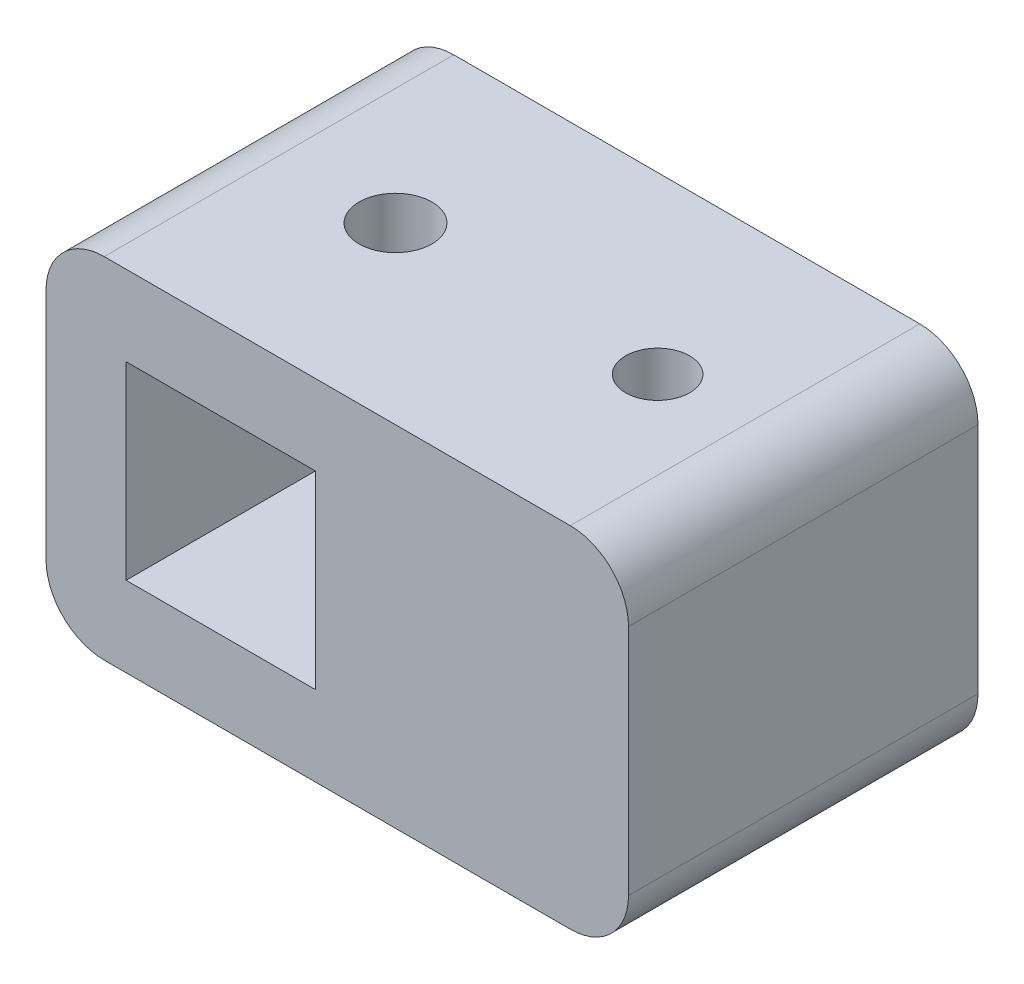
ISO-10303-21;
HEADER;
FILE_DESCRIPTION(('STEP AP214'),'2;1');
FILE_NAME('part.step','',(''),(''),'','','');
FILE_SCHEMA(('AUTOMOTIVE_DESIGN { 1 0 10303 214 1 1 1 1 }'));
ENDSEC;
DATA;
#1=APPLICATION_CONTEXT('core data for automotive mechanical design processes');
#2=APPLICATION_PROTOCOL_DEFINITION('international standard','automotive_design',2000,#1);
#3=PRODUCT_CONTEXT('',#1,'mechanical');
#4=PRODUCT('Part','Part','',(#3));
#5=PRODUCT_RELATED_PRODUCT_CATEGORY('part','',(#4));
#6=PRODUCT_DEFINITION_FORMATION('','',#4);
#7=PRODUCT_DEFINITION_CONTEXT('part definition',#1,'design');
#8=PRODUCT_DEFINITION('design','',#6,#7);
#9=PRODUCT_DEFINITION_SHAPE('','',#8);
#10=(LENGTH_UNIT() NAMED_UNIT(*) SI_UNIT(.MILLI.,.METRE.));
#11=(NAMED_UNIT(*) PLANE_ANGLE_UNIT() SI_UNIT($,.RADIAN.));
#12=(NAMED_UNIT(*) SI_UNIT($,.STERADIAN.) SOLID_ANGLE_UNIT());
#13=UNCERTAINTY_MEASURE_WITH_UNIT(LENGTH_MEASURE(1.E-05),#10,'distance_accuracy_value','');
#14=(GEOMETRIC_REPRESENTATION_CONTEXT(3) GLOBAL_UNCERTAINTY_ASSIGNED_CONTEXT((#13)) GLOBAL_UNIT_ASSIGNED_CONTEXT((#10,
#11,#12)) REPRESENTATION_CONTEXT('',''));
#15=CARTESIAN_POINT('',(0.,0.,0.));
#16=DIRECTION('',(0.,0.,1.));
#17=DIRECTION('',(1.,0.,0.));
#18=AXIS2_PLACEMENT_3D('',#15,#16,#17);
#19=CARTESIAN_POINT('',(0.,0.,-12.));
#20=DIRECTION('',(0.,0.,-1.));
#21=DIRECTION('',(-1.,0.,0.));
#22=AXIS2_PLACEMENT_3D('',#19,#20,#21);
#23=PLANE('',#22);
#24=DIRECTION('',(1.,0.,0.));
#25=VECTOR('',#24,1.);
#26=CARTESIAN_POINT('',(-6.,6.,-12.));
#27=LINE('',#26,#25);
#28=CARTESIAN_POINT('',(-4.,6.,-12.));
#29=VERTEX_POINT('',#28);
#30=CARTESIAN_POINT('',(12.,6.,-12.));
#31=VERTEX_POINT('',#30);
#32=EDGE_CURVE('E164',#29,#31,#27,.T.);
#33=ORIENTED_EDGE('',*,*,#32,.T.);
#34=CARTESIAN_POINT('',(12.,4.,-12.));
#35=DIRECTION('',(0.,0.,-1.));
#36=DIRECTION('',(-1.,0.,0.));
#37=AXIS2_PLACEMENT_3D('',#34,#35,#36);
#38=CIRCLE('',#37,2.);
#39=CARTESIAN_POINT('',(14.,4.,-12.));
#40=VERTEX_POINT('',#39);
#41=EDGE_CURVE('E211',#31,#40,#38,.T.);
#42=ORIENTED_EDGE('',*,*,#41,.T.);
#43=DIRECTION('',(0.,1.,0.));
#44=VECTOR('',#43,1.);
#45=CARTESIAN_POINT('',(14.,-6.,-12.));
#46=LINE('',#45,#44);
#47=CARTESIAN_POINT('',(14.,-4.,-12.));
#48=VERTEX_POINT('',#47);
#49=EDGE_CURVE('E135',#48,#40,#46,.T.);
#50=ORIENTED_EDGE('',*,*,#49,.F.);
#51=CARTESIAN_POINT('',(12.,-4.,-12.));
#52=DIRECTION('',(0.,0.,-1.));
#53=DIRECTION('',(-1.,0.,0.));
#54=AXIS2_PLACEMENT_3D('',#51,#52,#53);
#55=CIRCLE('',#54,2.);
#56=CARTESIAN_POINT('',(12.,-6.,-12.));
#57=VERTEX_POINT('',#56);
#58=EDGE_CURVE('E209',#48,#57,#55,.T.);
#59=ORIENTED_EDGE('',*,*,#58,.T.);
#60=DIRECTION('',(-1.,0.,0.));
#61=VECTOR('',#60,1.);
#62=CARTESIAN_POINT('',(-6.,-6.,-12.));
#63=LINE('',#62,#61);
#64=CARTESIAN_POINT('',(-4.,-6.,-12.));
#65=VERTEX_POINT('',#64);
#66=EDGE_CURVE('E170',#57,#65,#63,.T.);
#67=ORIENTED_EDGE('',*,*,#66,.T.);
#68=CARTESIAN_POINT('',(-4.,-4.,-12.));
#69=DIRECTION('',(0.,0.,-1.));
#70=DIRECTION('',(-1.,0.,0.));
#71=AXIS2_PLACEMENT_3D('',#68,#69,#70);
#72=CIRCLE('',#71,2.);
#73=CARTESIAN_POINT('',(-6.,-4.,-12.));
#74=VERTEX_POINT('',#73);
#75=EDGE_CURVE('E55',#65,#74,#72,.T.);
#76=ORIENTED_EDGE('',*,*,#75,.T.);
#77=DIRECTION('',(0.,1.,0.));
#78=VECTOR('',#77,1.);
#79=CARTESIAN_POINT('',(-6.,-6.,-12.));
#80=LINE('',#79,#78);
#81=CARTESIAN_POINT('',(-6.,4.,-12.));
#82=VERTEX_POINT('',#81);
#83=EDGE_CURVE('E172',#74,#82,#80,.T.);
#84=ORIENTED_EDGE('',*,*,#83,.T.);
#85=CARTESIAN_POINT('',(-4.,4.,-12.));
#86=DIRECTION('',(0.,0.,-1.));
#87=DIRECTION('',(-1.,0.,0.));
#88=AXIS2_PLACEMENT_3D('',#85,#86,#87);
#89=CIRCLE('',#88,2.);
#90=EDGE_CURVE('E207',#82,#29,#89,.T.);
#91=ORIENTED_EDGE('',*,*,#90,.T.);
#92=EDGE_LOOP('',(#33,#42,#50,#59,#67,#76,#84,#91));
#93=FACE_BOUND('',#92,.T.);
#94=DIRECTION('',(-1.,0.,0.));
#95=VECTOR('',#94,1.);
#96=CARTESIAN_POINT('',(-3.25,-3.25,-12.));
#97=LINE('',#96,#95);
#98=CARTESIAN_POINT('',(3.25,-3.25,-12.));
#99=VERTEX_POINT('',#98);
#100=CARTESIAN_POINT('',(-3.25,-3.25,-12.));
#101=VERTEX_POINT('',#100);
#102=EDGE_CURVE('E134',#99,#101,#97,.T.);
#103=ORIENTED_EDGE('',*,*,#102,.F.);
#104=DIRECTION('',(0.,-1.,0.));
#105=VECTOR('',#104,1.);
#106=CARTESIAN_POINT('',(3.25,-3.25,-12.));
#107=LINE('',#106,#105);
#108=CARTESIAN_POINT('',(3.25,3.25,-12.));
#109=VERTEX_POINT('',#108);
#110=EDGE_CURVE('E125',#109,#99,#107,.T.);
#111=ORIENTED_EDGE('',*,*,#110,.F.);
#112=DIRECTION('',(1.,0.,0.));
#113=VECTOR('',#112,1.);
#114=CARTESIAN_POINT('',(-3.25,3.25,-12.));
#115=LINE('',#114,#113);
#116=CARTESIAN_POINT('',(-3.25,3.25,-12.));
#117=VERTEX_POINT('',#116);
#118=EDGE_CURVE('E150',#117,#109,#115,.T.);
#119=ORIENTED_EDGE('',*,*,#118,.F.);
#120=DIRECTION('',(0.,1.,0.));
#121=VECTOR('',#120,1.);
#122=CARTESIAN_POINT('',(-3.25,-3.25,-12.));
#123=LINE('',#122,#121);
#124=EDGE_CURVE('E148',#101,#117,#123,.T.);
#125=ORIENTED_EDGE('',*,*,#124,.F.);
#126=EDGE_LOOP('',(#103,#111,#119,#125));
#127=FACE_BOUND('',#126,.T.);
#128=ADVANCED_FACE('F34',(#93,#127),#23,.T.);
#129=CARTESIAN_POINT('',(0.,0.,0.));
#130=DIRECTION('',(0.,0.,-1.));
#131=DIRECTION('',(-1.,0.,0.));
#132=AXIS2_PLACEMENT_3D('',#129,#130,#131);
#133=PLANE('',#132);
#134=DIRECTION('',(0.,1.,0.));
#135=VECTOR('',#134,1.);
#136=CARTESIAN_POINT('',(-3.25,-3.25,0.));
#137=LINE('',#136,#135);
#138=CARTESIAN_POINT('',(-3.25,-3.25,0.));
#139=VERTEX_POINT('',#138);
#140=CARTESIAN_POINT('',(-3.25,3.25,0.));
#141=VERTEX_POINT('',#140);
#142=EDGE_CURVE('E159',#139,#141,#137,.T.);
#143=ORIENTED_EDGE('',*,*,#142,.T.);
#144=DIRECTION('',(1.,0.,0.));
#145=VECTOR('',#144,1.);
#146=CARTESIAN_POINT('',(-3.25,3.25,0.));
#147=LINE('',#146,#145);
#148=CARTESIAN_POINT('',(3.25,3.25,0.));
#149=VERTEX_POINT('',#148);
#150=EDGE_CURVE('E161',#141,#149,#147,.T.);
#151=ORIENTED_EDGE('',*,*,#150,.T.);
#152=DIRECTION('',(0.,-1.,0.));
#153=VECTOR('',#152,1.);
#154=CARTESIAN_POINT('',(3.25,-3.25,0.));
#155=LINE('',#154,#153);
#156=CARTESIAN_POINT('',(3.25,-3.25,0.));
#157=VERTEX_POINT('',#156);
#158=EDGE_CURVE('E155',#149,#157,#155,.T.);
#159=ORIENTED_EDGE('',*,*,#158,.T.);
#160=DIRECTION('',(-1.,0.,0.));
#161=VECTOR('',#160,1.);
#162=CARTESIAN_POINT('',(-3.25,-3.25,0.));
#163=LINE('',#162,#161);
#164=EDGE_CURVE('E142',#157,#139,#163,.T.);
#165=ORIENTED_EDGE('',*,*,#164,.T.);
#166=EDGE_LOOP('',(#143,#151,#159,#165));
#167=FACE_BOUND('',#166,.T.);
#168=DIRECTION('',(0.,-1.,0.));
#169=VECTOR('',#168,1.);
#170=CARTESIAN_POINT('',(14.,6.,0.));
#171=LINE('',#170,#169);
#172=CARTESIAN_POINT('',(14.,4.,0.));
#173=VERTEX_POINT('',#172);
#174=CARTESIAN_POINT('',(14.,-4.,0.));
#175=VERTEX_POINT('',#174);
#176=EDGE_CURVE('E186',#173,#175,#171,.T.);
#177=ORIENTED_EDGE('',*,*,#176,.F.);
#178=CARTESIAN_POINT('',(12.,4.,0.));
#179=DIRECTION('',(0.,0.,-1.));
#180=DIRECTION('',(-1.,0.,0.));
#181=AXIS2_PLACEMENT_3D('',#178,#179,#180);
#182=CIRCLE('',#181,2.);
#183=CARTESIAN_POINT('',(12.,6.,0.));
#184=VERTEX_POINT('',#183);
#185=EDGE_CURVE('E199',#173,#184,#182,.F.);
#186=ORIENTED_EDGE('',*,*,#185,.T.);
#187=DIRECTION('',(1.,0.,0.));
#188=VECTOR('',#187,1.);
#189=CARTESIAN_POINT('',(-6.,6.,0.));
#190=LINE('',#189,#188);
#191=CARTESIAN_POINT('',(-4.,6.,0.));
#192=VERTEX_POINT('',#191);
#193=EDGE_CURVE('E173',#192,#184,#190,.T.);
#194=ORIENTED_EDGE('',*,*,#193,.F.);
#195=CARTESIAN_POINT('',(-4.,4.,0.));
#196=DIRECTION('',(0.,0.,-1.));
#197=DIRECTION('',(-1.,0.,0.));
#198=AXIS2_PLACEMENT_3D('',#195,#196,#197);
#199=CIRCLE('',#198,2.);
#200=CARTESIAN_POINT('',(-6.,4.,0.));
#201=VERTEX_POINT('',#200);
#202=EDGE_CURVE('E195',#192,#201,#199,.F.);
#203=ORIENTED_EDGE('',*,*,#202,.T.);
#204=DIRECTION('',(0.,1.,0.));
#205=VECTOR('',#204,1.);
#206=CARTESIAN_POINT('',(-6.,-6.,0.));
#207=LINE('',#206,#205);
#208=CARTESIAN_POINT('',(-6.,-4.,0.));
#209=VERTEX_POINT('',#208);
#210=EDGE_CURVE('E179',#209,#201,#207,.T.);
#211=ORIENTED_EDGE('',*,*,#210,.F.);
#212=CARTESIAN_POINT('',(-4.,-4.,0.));
#213=DIRECTION('',(0.,0.,-1.));
#214=DIRECTION('',(-1.,0.,0.));
#215=AXIS2_PLACEMENT_3D('',#212,#213,#214);
#216=CIRCLE('',#215,2.);
#217=CARTESIAN_POINT('',(-4.,-6.,0.));
#218=VERTEX_POINT('',#217);
#219=EDGE_CURVE('E193',#209,#218,#216,.F.);
#220=ORIENTED_EDGE('',*,*,#219,.T.);
#221=DIRECTION('',(-1.,0.,0.));
#222=VECTOR('',#221,1.);
#223=CARTESIAN_POINT('',(-6.,-6.,0.));
#224=LINE('',#223,#222);
#225=CARTESIAN_POINT('',(12.,-6.,0.));
#226=VERTEX_POINT('',#225);
#227=EDGE_CURVE('E143',#226,#218,#224,.T.);
#228=ORIENTED_EDGE('',*,*,#227,.F.);
#229=CARTESIAN_POINT('',(12.,-4.,0.));
#230=DIRECTION('',(0.,0.,-1.));
#231=DIRECTION('',(-1.,0.,0.));
#232=AXIS2_PLACEMENT_3D('',#229,#230,#231);
#233=CIRCLE('',#232,2.);
#234=EDGE_CURVE('E197',#226,#175,#233,.F.);
#235=ORIENTED_EDGE('',*,*,#234,.T.);
#236=EDGE_LOOP('',(#177,#186,#194,#203,#211,#220,#228,#235));
#237=FACE_BOUND('',#236,.T.);
#238=ADVANCED_FACE('F224',(#167,#237),#133,.F.);
#239=CARTESIAN_POINT('',(-6.,-6.,-12.));
#240=DIRECTION('',(0.,1.,0.));
#241=DIRECTION('',(0.,0.,1.));
#242=AXIS2_PLACEMENT_3D('',#239,#240,#241);
#243=PLANE('',#242);
#244=CARTESIAN_POINT('',(0.,-6.,-6.));
#245=DIRECTION('',(0.,1.,0.));
#246=DIRECTION('',(0.,0.,1.));
#247=AXIS2_PLACEMENT_3D('',#244,#245,#246);
#248=CIRCLE('',#247,1.25);
#249=CARTESIAN_POINT('',(0.,-6.,-4.75));
#250=VERTEX_POINT('',#249);
#251=EDGE_CURVE('E250',#250,#250,#248,.T.);
#252=ORIENTED_EDGE('',*,*,#251,.T.);
#253=EDGE_LOOP('',(#252));
#254=FACE_BOUND('',#253,.T.);
#255=CARTESIAN_POINT('',(9.,-6.,-6.));
#256=DIRECTION('',(0.,1.,0.));
#257=DIRECTION('',(0.,0.,1.));
#258=AXIS2_PLACEMENT_3D('',#255,#256,#257);
#259=CIRCLE('',#258,1.1);
#260=CARTESIAN_POINT('',(9.,-6.,-4.9));
#261=VERTEX_POINT('',#260);
#262=EDGE_CURVE('E187',#261,#261,#259,.T.);
#263=ORIENTED_EDGE('',*,*,#262,.T.);
#264=EDGE_LOOP('',(#263));
#265=FACE_BOUND('',#264,.T.);
#266=ORIENTED_EDGE('',*,*,#66,.F.);
#267=DIRECTION('',(0.,0.,-1.));
#268=VECTOR('',#267,1.);
#269=CARTESIAN_POINT('',(12.,-6.,0.));
#270=LINE('',#269,#268);
#271=EDGE_CURVE('E215',#57,#226,#270,.F.);
#272=ORIENTED_EDGE('',*,*,#271,.T.);
#273=ORIENTED_EDGE('',*,*,#227,.T.);
#274=DIRECTION('',(0.,0.,1.));
#275=VECTOR('',#274,1.);
#276=CARTESIAN_POINT('',(-4.,-6.,-12.));
#277=LINE('',#276,#275);
#278=EDGE_CURVE('E213',#218,#65,#277,.F.);
#279=ORIENTED_EDGE('',*,*,#278,.T.);
#280=EDGE_LOOP('',(#266,#272,#273,#279));
#281=FACE_BOUND('',#280,.T.);
#282=ADVANCED_FACE('F275',(#254,#265,#281),#243,.F.);
#283=CARTESIAN_POINT('',(-6.,-6.,-12.));
#284=DIRECTION('',(1.,0.,0.));
#285=DIRECTION('',(0.,0.,-1.));
#286=AXIS2_PLACEMENT_3D('',#283,#284,#285);
#287=PLANE('',#286);
#288=ORIENTED_EDGE('',*,*,#210,.T.);
#289=DIRECTION('',(0.,0.,1.));
#290=VECTOR('',#289,1.);
#291=CARTESIAN_POINT('',(-6.,4.,-12.));
#292=LINE('',#291,#290);
#293=EDGE_CURVE('E11',#201,#82,#292,.F.);
#294=ORIENTED_EDGE('',*,*,#293,.T.);
#295=ORIENTED_EDGE('',*,*,#83,.F.);
#296=DIRECTION('',(0.,0.,1.));
#297=VECTOR('',#296,1.);
#298=CARTESIAN_POINT('',(-6.,-4.,-12.));
#299=LINE('',#298,#297);
#300=EDGE_CURVE('E43',#74,#209,#299,.T.);
#301=ORIENTED_EDGE('',*,*,#300,.T.);
#302=EDGE_LOOP('',(#288,#294,#295,#301));
#303=FACE_BOUND('',#302,.T.);
#304=ADVANCED_FACE('F220',(#303),#287,.F.);
#305=CARTESIAN_POINT('',(-6.,6.,-12.));
#306=DIRECTION('',(0.,-1.,0.));
#307=DIRECTION('',(0.,0.,-1.));
#308=AXIS2_PLACEMENT_3D('',#305,#306,#307);
#309=PLANE('',#308);
#310=CARTESIAN_POINT('',(0.,6.,-6.));
#311=DIRECTION('',(0.,1.,0.));
#312=DIRECTION('',(0.,0.,1.));
#313=AXIS2_PLACEMENT_3D('',#310,#311,#312);
#314=CIRCLE('',#313,1.25);
#315=CARTESIAN_POINT('',(0.,6.,-4.75));
#316=VERTEX_POINT('',#315);
#317=EDGE_CURVE('E256',#316,#316,#314,.T.);
#318=ORIENTED_EDGE('',*,*,#317,.F.);
#319=EDGE_LOOP('',(#318));
#320=FACE_BOUND('',#319,.T.);
#321=CARTESIAN_POINT('',(9.,6.,-6.));
#322=DIRECTION('',(0.,-1.,0.));
#323=DIRECTION('',(0.,0.,-1.));
#324=AXIS2_PLACEMENT_3D('',#321,#322,#323);
#325=CIRCLE('',#324,1.1);
#326=CARTESIAN_POINT('',(9.,6.,-7.1));
#327=VERTEX_POINT('',#326);
#328=EDGE_CURVE('E183',#327,#327,#325,.T.);
#329=ORIENTED_EDGE('',*,*,#328,.T.);
#330=EDGE_LOOP('',(#329));
#331=FACE_BOUND('',#330,.T.);
#332=ORIENTED_EDGE('',*,*,#193,.T.);
#333=DIRECTION('',(0.,0.,1.));
#334=VECTOR('',#333,1.);
#335=CARTESIAN_POINT('',(12.,6.,-12.));
#336=LINE('',#335,#334);
#337=EDGE_CURVE('E204',#184,#31,#336,.F.);
#338=ORIENTED_EDGE('',*,*,#337,.T.);
#339=ORIENTED_EDGE('',*,*,#32,.F.);
#340=DIRECTION('',(0.,0.,1.));
#341=VECTOR('',#340,1.);
#342=CARTESIAN_POINT('',(-4.,6.,-12.));
#343=LINE('',#342,#341);
#344=EDGE_CURVE('E201',#29,#192,#343,.T.);
#345=ORIENTED_EDGE('',*,*,#344,.T.);
#346=EDGE_LOOP('',(#332,#338,#339,#345));
#347=FACE_BOUND('',#346,.T.);
#348=ADVANCED_FACE('F233',(#320,#331,#347),#309,.F.);
#349=CARTESIAN_POINT('',(3.25,-3.25,-12.));
#350=DIRECTION('',(-1.,0.,0.));
#351=DIRECTION('',(0.,0.,1.));
#352=AXIS2_PLACEMENT_3D('',#349,#350,#351);
#353=PLANE('',#352);
#354=ORIENTED_EDGE('',*,*,#158,.F.);
#355=DIRECTION('',(0.,0.,1.));
#356=VECTOR('',#355,1.);
#357=CARTESIAN_POINT('',(3.25,3.25,-12.));
#358=LINE('',#357,#356);
#359=EDGE_CURVE('E130',#109,#149,#358,.T.);
#360=ORIENTED_EDGE('',*,*,#359,.F.);
#361=ORIENTED_EDGE('',*,*,#110,.T.);
#362=DIRECTION('',(0.,0.,1.));
#363=VECTOR('',#362,1.);
#364=CARTESIAN_POINT('',(3.25,-3.25,-12.));
#365=LINE('',#364,#363);
#366=EDGE_CURVE('E128',#99,#157,#365,.T.);
#367=ORIENTED_EDGE('',*,*,#366,.T.);
#368=EDGE_LOOP('',(#354,#360,#361,#367));
#369=FACE_BOUND('',#368,.T.);
#370=ADVANCED_FACE('F127',(#369),#353,.T.);
#371=CARTESIAN_POINT('',(-3.25,-3.25,-12.));
#372=DIRECTION('',(0.,1.,0.));
#373=DIRECTION('',(0.,0.,1.));
#374=AXIS2_PLACEMENT_3D('',#371,#372,#373);
#375=PLANE('',#374);
#376=CARTESIAN_POINT('',(0.,-3.25,-6.));
#377=DIRECTION('',(0.,1.,0.));
#378=DIRECTION('',(0.,0.,1.));
#379=AXIS2_PLACEMENT_3D('',#376,#377,#378);
#380=CIRCLE('',#379,1.25);
#381=CARTESIAN_POINT('',(0.,-3.25,-4.75));
#382=VERTEX_POINT('',#381);
#383=EDGE_CURVE('E253',#382,#382,#380,.T.);
#384=ORIENTED_EDGE('',*,*,#383,.F.);
#385=EDGE_LOOP('',(#384));
#386=FACE_BOUND('',#385,.T.);
#387=ORIENTED_EDGE('',*,*,#164,.F.);
#388=ORIENTED_EDGE('',*,*,#366,.F.);
#389=ORIENTED_EDGE('',*,*,#102,.T.);
#390=DIRECTION('',(0.,0.,1.));
#391=VECTOR('',#390,1.);
#392=CARTESIAN_POINT('',(-3.25,-3.25,-12.));
#393=LINE('',#392,#391);
#394=EDGE_CURVE('E144',#101,#139,#393,.T.);
#395=ORIENTED_EDGE('',*,*,#394,.T.);
#396=EDGE_LOOP('',(#387,#388,#389,#395));
#397=FACE_BOUND('',#396,.T.);
#398=ADVANCED_FACE('F139',(#386,#397),#375,.T.);
#399=CARTESIAN_POINT('',(-3.25,-3.25,-12.));
#400=DIRECTION('',(1.,0.,0.));
#401=DIRECTION('',(0.,0.,-1.));
#402=AXIS2_PLACEMENT_3D('',#399,#400,#401);
#403=PLANE('',#402);
#404=ORIENTED_EDGE('',*,*,#142,.F.);
#405=ORIENTED_EDGE('',*,*,#394,.F.);
#406=ORIENTED_EDGE('',*,*,#124,.T.);
#407=DIRECTION('',(0.,0.,1.));
#408=VECTOR('',#407,1.);
#409=CARTESIAN_POINT('',(-3.25,3.25,-12.));
#410=LINE('',#409,#408);
#411=EDGE_CURVE('E166',#117,#141,#410,.T.);
#412=ORIENTED_EDGE('',*,*,#411,.T.);
#413=EDGE_LOOP('',(#404,#405,#406,#412));
#414=FACE_BOUND('',#413,.T.);
#415=ADVANCED_FACE('F268',(#414),#403,.T.);
#416=CARTESIAN_POINT('',(-3.25,3.25,-12.));
#417=DIRECTION('',(0.,-1.,0.));
#418=DIRECTION('',(0.,0.,-1.));
#419=AXIS2_PLACEMENT_3D('',#416,#417,#418);
#420=PLANE('',#419);
#421=CARTESIAN_POINT('',(0.,3.25,-6.));
#422=DIRECTION('',(0.,-1.,0.));
#423=DIRECTION('',(0.,0.,-1.));
#424=AXIS2_PLACEMENT_3D('',#421,#422,#423);
#425=CIRCLE('',#424,1.25);
#426=CARTESIAN_POINT('',(0.,3.25,-7.25));
#427=VERTEX_POINT('',#426);
#428=EDGE_CURVE('E38',#427,#427,#425,.T.);
#429=ORIENTED_EDGE('',*,*,#428,.F.);
#430=EDGE_LOOP('',(#429));
#431=FACE_BOUND('',#430,.T.);
#432=ORIENTED_EDGE('',*,*,#150,.F.);
#433=ORIENTED_EDGE('',*,*,#411,.F.);
#434=ORIENTED_EDGE('',*,*,#118,.T.);
#435=ORIENTED_EDGE('',*,*,#359,.T.);
#436=EDGE_LOOP('',(#432,#433,#434,#435));
#437=FACE_BOUND('',#436,.T.);
#438=ADVANCED_FACE('F265',(#431,#437),#420,.T.);
#439=CARTESIAN_POINT('',(14.,0.,0.));
#440=DIRECTION('',(1.,0.,0.));
#441=DIRECTION('',(0.,0.,-1.));
#442=AXIS2_PLACEMENT_3D('',#439,#440,#441);
#443=PLANE('',#442);
#444=ORIENTED_EDGE('',*,*,#49,.T.);
#445=DIRECTION('',(0.,0.,1.));
#446=VECTOR('',#445,1.);
#447=CARTESIAN_POINT('',(14.,4.,0.));
#448=LINE('',#447,#446);
#449=EDGE_CURVE('E190',#40,#173,#448,.T.);
#450=ORIENTED_EDGE('',*,*,#449,.T.);
#451=ORIENTED_EDGE('',*,*,#176,.T.);
#452=DIRECTION('',(0.,0.,-1.));
#453=VECTOR('',#452,1.);
#454=CARTESIAN_POINT('',(14.,-4.,-12.));
#455=LINE('',#454,#453);
#456=EDGE_CURVE('E157',#175,#48,#455,.T.);
#457=ORIENTED_EDGE('',*,*,#456,.T.);
#458=EDGE_LOOP('',(#444,#450,#451,#457));
#459=FACE_BOUND('',#458,.T.);
#460=ADVANCED_FACE('F243',(#459),#443,.T.);
#461=CARTESIAN_POINT('',(9.,-6.,-6.));
#462=DIRECTION('',(0.,1.,0.));
#463=DIRECTION('',(0.,0.,1.));
#464=AXIS2_PLACEMENT_3D('',#461,#462,#463);
#465=CYLINDRICAL_SURFACE('',#464,1.1);
#466=ORIENTED_EDGE('',*,*,#262,.F.);
#467=EDGE_LOOP('',(#466));
#468=FACE_BOUND('',#467,.T.);
#469=ORIENTED_EDGE('',*,*,#328,.F.);
#470=EDGE_LOOP('',(#469));
#471=FACE_BOUND('',#470,.T.);
#472=ADVANCED_FACE('F295',(#468,#471),#465,.F.);
#473=CARTESIAN_POINT('',(12.,4.,0.));
#474=DIRECTION('',(0.,0.,-1.));
#475=DIRECTION('',(-1.,0.,0.));
#476=AXIS2_PLACEMENT_3D('',#473,#474,#475);
#477=CYLINDRICAL_SURFACE('',#476,2.);
#478=ORIENTED_EDGE('',*,*,#41,.F.);
#479=ORIENTED_EDGE('',*,*,#337,.F.);
#480=ORIENTED_EDGE('',*,*,#185,.F.);
#481=ORIENTED_EDGE('',*,*,#449,.F.);
#482=EDGE_LOOP('',(#478,#479,#480,#481));
#483=FACE_BOUND('',#482,.T.);
#484=ADVANCED_FACE('F240',(#483),#477,.T.);
#485=CARTESIAN_POINT('',(12.,-4.,0.));
#486=DIRECTION('',(0.,0.,1.));
#487=DIRECTION('',(1.,0.,0.));
#488=AXIS2_PLACEMENT_3D('',#485,#486,#487);
#489=CYLINDRICAL_SURFACE('',#488,2.);
#490=ORIENTED_EDGE('',*,*,#234,.F.);
#491=ORIENTED_EDGE('',*,*,#271,.F.);
#492=ORIENTED_EDGE('',*,*,#58,.F.);
#493=ORIENTED_EDGE('',*,*,#456,.F.);
#494=EDGE_LOOP('',(#490,#491,#492,#493));
#495=FACE_BOUND('',#494,.T.);
#496=ADVANCED_FACE('F294',(#495),#489,.T.);
#497=CARTESIAN_POINT('',(-4.,4.,-12.));
#498=DIRECTION('',(0.,0.,1.));
#499=DIRECTION('',(1.,0.,0.));
#500=AXIS2_PLACEMENT_3D('',#497,#498,#499);
#501=CYLINDRICAL_SURFACE('',#500,2.);
#502=ORIENTED_EDGE('',*,*,#90,.F.);
#503=ORIENTED_EDGE('',*,*,#293,.F.);
#504=ORIENTED_EDGE('',*,*,#202,.F.);
#505=ORIENTED_EDGE('',*,*,#344,.F.);
#506=EDGE_LOOP('',(#502,#503,#504,#505));
#507=FACE_BOUND('',#506,.T.);
#508=ADVANCED_FACE('F230',(#507),#501,.T.);
#509=CARTESIAN_POINT('',(-4.,-4.,-12.));
#510=DIRECTION('',(0.,0.,1.));
#511=DIRECTION('',(1.,0.,0.));
#512=AXIS2_PLACEMENT_3D('',#509,#510,#511);
#513=CYLINDRICAL_SURFACE('',#512,2.);
#514=ORIENTED_EDGE('',*,*,#75,.F.);
#515=ORIENTED_EDGE('',*,*,#278,.F.);
#516=ORIENTED_EDGE('',*,*,#219,.F.);
#517=ORIENTED_EDGE('',*,*,#300,.F.);
#518=EDGE_LOOP('',(#514,#515,#516,#517));
#519=FACE_BOUND('',#518,.T.);
#520=ADVANCED_FACE('F36',(#519),#513,.T.);
#521=CARTESIAN_POINT('',(0.,-7.,-6.));
#522=DIRECTION('',(0.,1.,0.));
#523=DIRECTION('',(0.,0.,1.));
#524=AXIS2_PLACEMENT_3D('',#521,#522,#523);
#525=CYLINDRICAL_SURFACE('',#524,1.25);
#526=ORIENTED_EDGE('',*,*,#428,.T.);
#527=EDGE_LOOP('',(#526));
#528=FACE_BOUND('',#527,.T.);
#529=ORIENTED_EDGE('',*,*,#317,.T.);
#530=EDGE_LOOP('',(#529));
#531=FACE_BOUND('',#530,.T.);
#532=ADVANCED_FACE('F263',(#528,#531),#525,.F.);
#533=ORIENTED_EDGE('',*,*,#383,.T.);
#534=EDGE_LOOP('',(#533));
#535=FACE_BOUND('',#534,.T.);
#536=ORIENTED_EDGE('',*,*,#251,.F.);
#537=EDGE_LOOP('',(#536));
#538=FACE_BOUND('',#537,.T.);
#539=ADVANCED_FACE('F305',(#535,#538),#525,.F.);
#540=CLOSED_SHELL('',(#128,#238,#282,#304,#348,#370,#398,#415,#438,#460,#472,#484,#496,#508,
#520,#532,#539));
#541=MANIFOLD_SOLID_BREP('B2',#540);
#542=ADVANCED_BREP_SHAPE_REPRESENTATION('',(#18,#541),#14);
#543=SHAPE_DEFINITION_REPRESENTATION(#9,#542);
ENDSEC;
END-ISO-10303-21;
